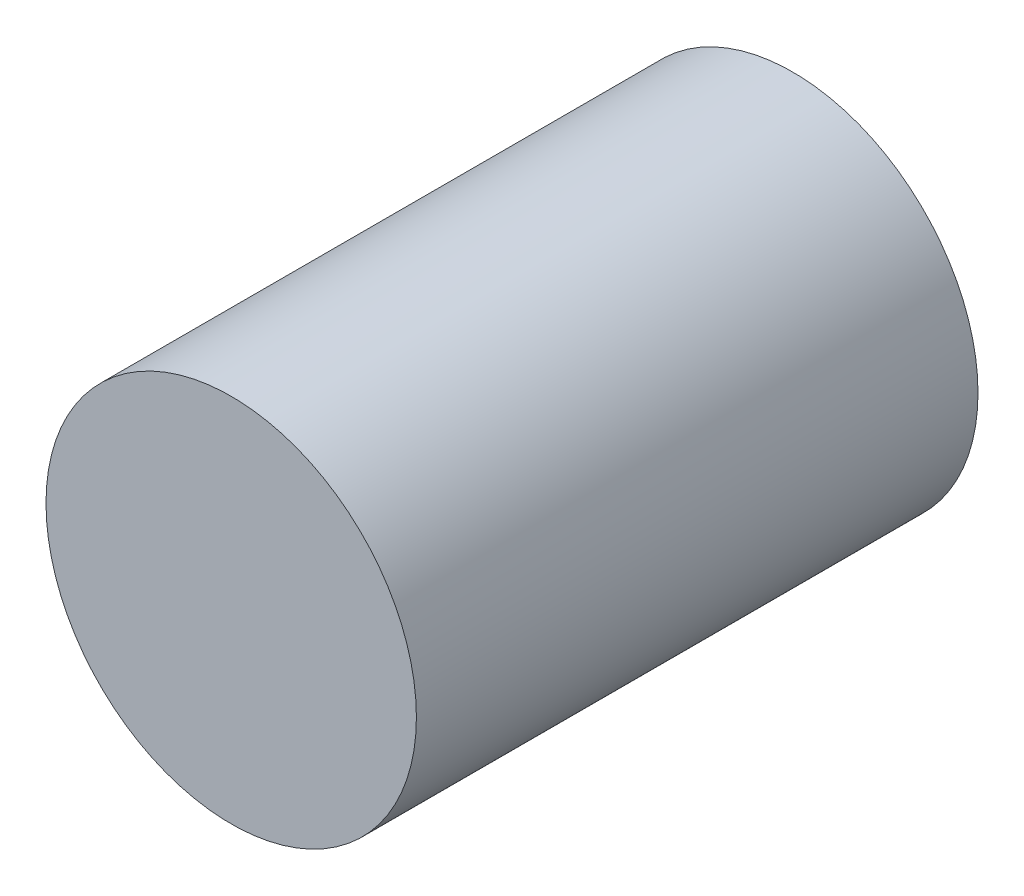
ISO-10303-21;
HEADER;
FILE_DESCRIPTION(('STEP AP214'),'2;1');
FILE_NAME('part.step','',(''),(''),'','','');
FILE_SCHEMA(('AUTOMOTIVE_DESIGN { 1 0 10303 214 1 1 1 1 }'));
ENDSEC;
DATA;
#1=APPLICATION_CONTEXT('core data for automotive mechanical design processes');
#2=APPLICATION_PROTOCOL_DEFINITION('international standard','automotive_design',2000,#1);
#3=PRODUCT_CONTEXT('',#1,'mechanical');
#4=PRODUCT('Part','Part','',(#3));
#5=PRODUCT_RELATED_PRODUCT_CATEGORY('part','',(#4));
#6=PRODUCT_DEFINITION_FORMATION('','',#4);
#7=PRODUCT_DEFINITION_CONTEXT('part definition',#1,'design');
#8=PRODUCT_DEFINITION('design','',#6,#7);
#9=PRODUCT_DEFINITION_SHAPE('','',#8);
#10=(LENGTH_UNIT() NAMED_UNIT(*) SI_UNIT(.MILLI.,.METRE.));
#11=(NAMED_UNIT(*) PLANE_ANGLE_UNIT() SI_UNIT($,.RADIAN.));
#12=(NAMED_UNIT(*) SI_UNIT($,.STERADIAN.) SOLID_ANGLE_UNIT());
#13=UNCERTAINTY_MEASURE_WITH_UNIT(LENGTH_MEASURE(1.E-05),#10,'distance_accuracy_value','');
#14=(GEOMETRIC_REPRESENTATION_CONTEXT(3) GLOBAL_UNCERTAINTY_ASSIGNED_CONTEXT((#13)) GLOBAL_UNIT_ASSIGNED_CONTEXT((#10,
#11,#12)) REPRESENTATION_CONTEXT('',''));
#15=CARTESIAN_POINT('',(0.,0.,0.));
#16=DIRECTION('',(0.,0.,1.));
#17=DIRECTION('',(1.,0.,0.));
#18=AXIS2_PLACEMENT_3D('',#15,#16,#17);
#19=CARTESIAN_POINT('',(0.,0.,9.4));
#20=DIRECTION('',(0.,0.,-1.));
#21=DIRECTION('',(-1.,0.,0.));
#22=AXIS2_PLACEMENT_3D('',#19,#20,#21);
#23=CYLINDRICAL_SURFACE('',#22,3.1);
#24=CARTESIAN_POINT('',(0.,0.,9.4));
#25=DIRECTION('',(0.,0.,1.));
#26=DIRECTION('',(1.,0.,0.));
#27=AXIS2_PLACEMENT_3D('',#24,#25,#26);
#28=CIRCLE('',#27,3.1);
#29=CARTESIAN_POINT('',(3.1,0.,9.4));
#30=VERTEX_POINT('',#29);
#31=EDGE_CURVE('E10',#30,#30,#28,.T.);
#32=ORIENTED_EDGE('',*,*,#31,.F.);
#33=EDGE_LOOP('',(#32));
#34=FACE_BOUND('',#33,.T.);
#35=CARTESIAN_POINT('',(0.,0.,0.));
#36=DIRECTION('',(0.,0.,1.));
#37=DIRECTION('',(1.,0.,0.));
#38=AXIS2_PLACEMENT_3D('',#35,#36,#37);
#39=CIRCLE('',#38,3.1);
#40=CARTESIAN_POINT('',(3.1,0.,0.));
#41=VERTEX_POINT('',#40);
#42=EDGE_CURVE('E34',#41,#41,#39,.T.);
#43=ORIENTED_EDGE('',*,*,#42,.T.);
#44=EDGE_LOOP('',(#43));
#45=FACE_BOUND('',#44,.T.);
#46=ADVANCED_FACE('F31',(#34,#45),#23,.T.);
#47=CARTESIAN_POINT('',(0.,0.,9.4));
#48=DIRECTION('',(0.,0.,1.));
#49=DIRECTION('',(1.,0.,0.));
#50=AXIS2_PLACEMENT_3D('',#47,#48,#49);
#51=PLANE('',#50);
#52=ORIENTED_EDGE('',*,*,#31,.T.);
#53=EDGE_LOOP('',(#52));
#54=FACE_BOUND('',#53,.T.);
#55=ADVANCED_FACE('F46',(#54),#51,.T.);
#56=CARTESIAN_POINT('',(0.,0.,0.));
#57=DIRECTION('',(0.,0.,1.));
#58=DIRECTION('',(1.,0.,0.));
#59=AXIS2_PLACEMENT_3D('',#56,#57,#58);
#60=PLANE('',#59);
#61=ORIENTED_EDGE('',*,*,#42,.F.);
#62=EDGE_LOOP('',(#61));
#63=FACE_BOUND('',#62,.T.);
#64=ADVANCED_FACE('F44',(#63),#60,.F.);
#65=CLOSED_SHELL('',(#46,#55,#64));
#66=MANIFOLD_SOLID_BREP('B2',#65);
#67=ADVANCED_BREP_SHAPE_REPRESENTATION('',(#18,#66),#14);
#68=SHAPE_DEFINITION_REPRESENTATION(#9,#67);
ENDSEC;
END-ISO-10303-21;
